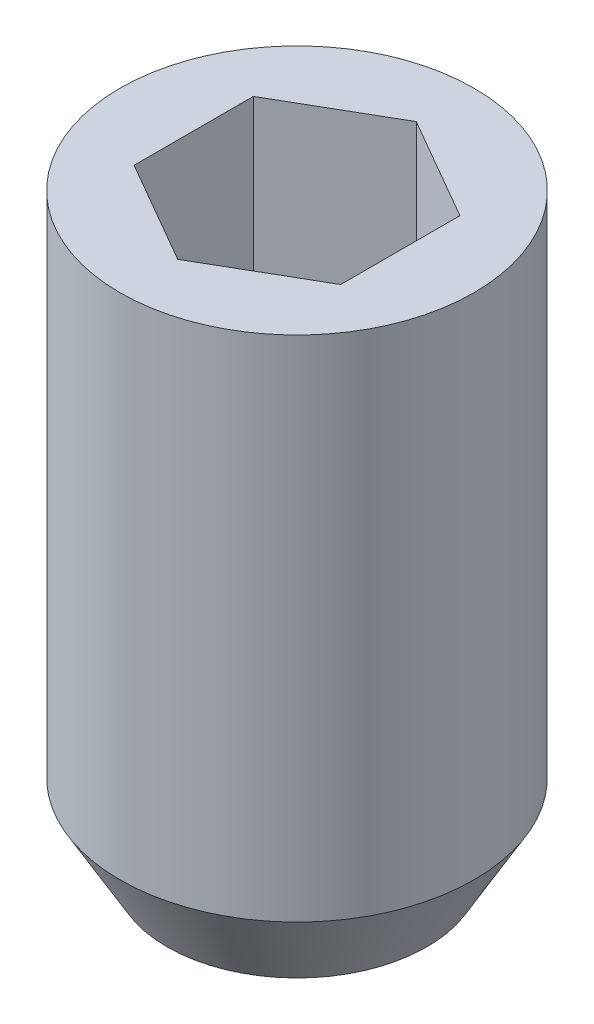
ISO-10303-21;
HEADER;
FILE_DESCRIPTION(('STEP AP214'),'2;1');
FILE_NAME('part.step','',(''),(''),'','','');
FILE_SCHEMA(('AUTOMOTIVE_DESIGN { 1 0 10303 214 1 1 1 1 }'));
ENDSEC;
DATA;
#1=APPLICATION_CONTEXT('core data for automotive mechanical design processes');
#2=APPLICATION_PROTOCOL_DEFINITION('international standard','automotive_design',2000,#1);
#3=PRODUCT_CONTEXT('',#1,'mechanical');
#4=PRODUCT('Part','Part','',(#3));
#5=PRODUCT_RELATED_PRODUCT_CATEGORY('part','',(#4));
#6=PRODUCT_DEFINITION_FORMATION('','',#4);
#7=PRODUCT_DEFINITION_CONTEXT('part definition',#1,'design');
#8=PRODUCT_DEFINITION('design','',#6,#7);
#9=PRODUCT_DEFINITION_SHAPE('','',#8);
#10=(LENGTH_UNIT() NAMED_UNIT(*) SI_UNIT(.MILLI.,.METRE.));
#11=(NAMED_UNIT(*) PLANE_ANGLE_UNIT() SI_UNIT($,.RADIAN.));
#12=(NAMED_UNIT(*) SI_UNIT($,.STERADIAN.) SOLID_ANGLE_UNIT());
#13=UNCERTAINTY_MEASURE_WITH_UNIT(LENGTH_MEASURE(1.E-05),#10,'distance_accuracy_value','');
#14=(GEOMETRIC_REPRESENTATION_CONTEXT(3) GLOBAL_UNCERTAINTY_ASSIGNED_CONTEXT((#13)) GLOBAL_UNIT_ASSIGNED_CONTEXT((#10,
#11,#12)) REPRESENTATION_CONTEXT('',''));
#15=CARTESIAN_POINT('',(0.,0.,0.));
#16=DIRECTION('',(0.,0.,1.));
#17=DIRECTION('',(1.,0.,0.));
#18=AXIS2_PLACEMENT_3D('',#15,#16,#17);
#19=CARTESIAN_POINT('',(0.,5.00000000000007,0.));
#20=DIRECTION('',(0.,-1.,0.));
#21=DIRECTION('',(0.,0.,-1.));
#22=AXIS2_PLACEMENT_3D('',#19,#20,#21);
#23=CYLINDRICAL_SURFACE('',#22,1.5);
#24=CARTESIAN_POINT('',(0.,0.692820323027574,0.));
#25=DIRECTION('',(0.,1.,0.));
#26=DIRECTION('',(0.,0.,1.));
#27=AXIS2_PLACEMENT_3D('',#24,#25,#26);
#28=CIRCLE('',#27,1.5);
#29=CARTESIAN_POINT('',(0.,0.692820323027573,1.50000000000002));
#30=VERTEX_POINT('',#29);
#31=EDGE_CURVE('E56',#30,#30,#28,.T.);
#32=ORIENTED_EDGE('',*,*,#31,.T.);
#33=EDGE_LOOP('',(#32));
#34=FACE_BOUND('',#33,.T.);
#35=CARTESIAN_POINT('',(0.,5.00000000000007,0.));
#36=DIRECTION('',(0.,1.,0.));
#37=DIRECTION('',(0.,0.,1.));
#38=AXIS2_PLACEMENT_3D('',#35,#36,#37);
#39=CIRCLE('',#38,1.5);
#40=CARTESIAN_POINT('',(0.,5.00000000000007,1.50000000000002));
#41=VERTEX_POINT('',#40);
#42=EDGE_CURVE('E150',#41,#41,#39,.T.);
#43=ORIENTED_EDGE('',*,*,#42,.F.);
#44=EDGE_LOOP('',(#43));
#45=FACE_BOUND('',#44,.T.);
#46=ADVANCED_FACE('F48',(#34,#45),#23,.T.);
#47=CARTESIAN_POINT('',(0.,5.00000000000007,0.));
#48=DIRECTION('',(0.,1.,0.));
#49=DIRECTION('',(0.,0.,1.));
#50=AXIS2_PLACEMENT_3D('',#47,#48,#49);
#51=PLANE('',#50);
#52=DIRECTION('',(0.866025403784439,0.,-0.500000000000001));
#53=VECTOR('',#52,1.);
#54=CARTESIAN_POINT('',(-1.04083408558608E-13,5.00000000000003,1.01036297108184));
#55=LINE('',#54,#53);
#56=CARTESIAN_POINT('',(-1.04083408558608E-13,5.00000000000003,1.01036297108184));
#57=VERTEX_POINT('',#56);
#58=CARTESIAN_POINT('',(0.874999999999876,5.00000000000002,0.505181485540962));
#59=VERTEX_POINT('',#58);
#60=EDGE_CURVE('E63',#57,#59,#55,.T.);
#61=ORIENTED_EDGE('',*,*,#60,.F.);
#62=DIRECTION('',(0.866025403784439,0.,0.500000000000001));
#63=VECTOR('',#62,1.);
#64=CARTESIAN_POINT('',(-0.875000000000049,5.00000000000007,0.505181485540962));
#65=LINE('',#64,#63);
#66=CARTESIAN_POINT('',(-0.875000000000049,5.00000000000007,0.505181485540962));
#67=VERTEX_POINT('',#66);
#68=EDGE_CURVE('E146',#67,#57,#65,.T.);
#69=ORIENTED_EDGE('',*,*,#68,.F.);
#70=DIRECTION('',(0.,0.,1.));
#71=VECTOR('',#70,1.);
#72=CARTESIAN_POINT('',(-0.875000000000049,5.00000000000003,-0.505181485540934));
#73=LINE('',#72,#71);
#74=CARTESIAN_POINT('',(-0.875000000000049,5.00000000000003,-0.505181485540934));
#75=VERTEX_POINT('',#74);
#76=EDGE_CURVE('E144',#75,#67,#73,.T.);
#77=ORIENTED_EDGE('',*,*,#76,.F.);
#78=DIRECTION('',(-0.866025403784439,0.,0.500000000000001));
#79=VECTOR('',#78,1.);
#80=CARTESIAN_POINT('',(0.,5.00000000000007,-1.01036297108183));
#81=LINE('',#80,#79);
#82=CARTESIAN_POINT('',(0.,5.00000000000007,-1.01036297108183));
#83=VERTEX_POINT('',#82);
#84=EDGE_CURVE('E111',#83,#75,#81,.T.);
#85=ORIENTED_EDGE('',*,*,#84,.F.);
#86=DIRECTION('',(-0.866025403784438,0.,-0.5));
#87=VECTOR('',#86,1.);
#88=CARTESIAN_POINT('',(0.874999999999911,5.0000000000001,-0.505181485540893));
#89=LINE('',#88,#87);
#90=CARTESIAN_POINT('',(0.874999999999911,5.0000000000001,-0.505181485540893));
#91=VERTEX_POINT('',#90);
#92=EDGE_CURVE('E140',#91,#83,#89,.T.);
#93=ORIENTED_EDGE('',*,*,#92,.F.);
#94=DIRECTION('',(0.,0.,-1.));
#95=VECTOR('',#94,1.);
#96=CARTESIAN_POINT('',(0.874999999999876,5.00000000000002,0.505181485540962));
#97=LINE('',#96,#95);
#98=EDGE_CURVE('E137',#59,#91,#97,.T.);
#99=ORIENTED_EDGE('',*,*,#98,.F.);
#100=EDGE_LOOP('',(#61,#69,#77,#85,#93,#99));
#101=FACE_BOUND('',#100,.T.);
#102=ORIENTED_EDGE('',*,*,#42,.T.);
#103=EDGE_LOOP('',(#102));
#104=FACE_BOUND('',#103,.T.);
#105=ADVANCED_FACE('F172',(#101,#104),#51,.T.);
#106=CARTESIAN_POINT('',(0.,0.,0.));
#107=DIRECTION('',(0.,1.,0.));
#108=DIRECTION('',(0.,0.,1.));
#109=AXIS2_PLACEMENT_3D('',#106,#107,#108);
#110=PLANE('',#109);
#111=CARTESIAN_POINT('',(0.,0.,0.));
#112=DIRECTION('',(0.,1.,0.));
#113=DIRECTION('',(0.,0.,1.));
#114=AXIS2_PLACEMENT_3D('',#111,#112,#113);
#115=CIRCLE('',#114,1.1);
#116=CARTESIAN_POINT('',(0.,0.,1.1));
#117=VERTEX_POINT('',#116);
#118=EDGE_CURVE('E13',#117,#117,#115,.F.);
#119=ORIENTED_EDGE('',*,*,#118,.T.);
#120=EDGE_LOOP('',(#119));
#121=FACE_BOUND('',#120,.T.);
#122=ADVANCED_FACE('F164',(#121),#110,.F.);
#123=CARTESIAN_POINT('',(0.,0.692820323027574,0.));
#124=DIRECTION('',(0.,1.,0.));
#125=DIRECTION('',(0.,0.,1.));
#126=AXIS2_PLACEMENT_3D('',#123,#124,#125);
#127=CONICAL_SURFACE('',#126,1.5,0.5235987755983);
#128=ORIENTED_EDGE('',*,*,#118,.F.);
#129=EDGE_LOOP('',(#128));
#130=FACE_BOUND('',#129,.T.);
#131=ORIENTED_EDGE('',*,*,#31,.F.);
#132=EDGE_LOOP('',(#131));
#133=FACE_BOUND('',#132,.T.);
#134=ADVANCED_FACE('F50',(#130,#133),#127,.T.);
#135=CARTESIAN_POINT('',(-1.17961196366423E-13,2.00000000000003,1.01036297108185));
#136=DIRECTION('',(0.499999999999999,0.,0.866025403784439));
#137=DIRECTION('',(0.866025403784439,0.,-0.500000000000001));
#138=AXIS2_PLACEMENT_3D('',#135,#136,#137);
#139=PLANE('',#138);
#140=ORIENTED_EDGE('',*,*,#60,.T.);
#141=DIRECTION('',(0.,1.,0.));
#142=VECTOR('',#141,1.);
#143=CARTESIAN_POINT('',(0.874999999999952,2.00000000000007,0.50518148554092));
#144=LINE('',#143,#142);
#145=CARTESIAN_POINT('',(0.874999999999952,2.00000000000007,0.50518148554092));
#146=VERTEX_POINT('',#145);
#147=EDGE_CURVE('E93',#146,#59,#144,.T.);
#148=ORIENTED_EDGE('',*,*,#147,.F.);
#149=DIRECTION('',(0.866025403784439,0.,-0.500000000000001));
#150=VECTOR('',#149,1.);
#151=CARTESIAN_POINT('',(-1.17961196366423E-13,2.00000000000003,1.01036297108185));
#152=LINE('',#151,#150);
#153=CARTESIAN_POINT('',(-1.17961196366423E-13,2.00000000000003,1.01036297108185));
#154=VERTEX_POINT('',#153);
#155=EDGE_CURVE('E148',#154,#146,#152,.T.);
#156=ORIENTED_EDGE('',*,*,#155,.F.);
#157=DIRECTION('',(0.,1.,0.));
#158=VECTOR('',#157,1.);
#159=CARTESIAN_POINT('',(-1.17961196366423E-13,2.00000000000003,1.01036297108185));
#160=LINE('',#159,#158);
#161=EDGE_CURVE('E71',#154,#57,#160,.T.);
#162=ORIENTED_EDGE('',*,*,#161,.T.);
#163=EDGE_LOOP('',(#140,#148,#156,#162));
#164=FACE_BOUND('',#163,.T.);
#165=ADVANCED_FACE('F163',(#164),#139,.F.);
#166=CARTESIAN_POINT('',(-0.875000000000119,2.00000000000003,0.505181485540948));
#167=DIRECTION('',(-0.5,0.,0.86602540378444));
#168=DIRECTION('',(0.866025403784439,0.,0.500000000000001));
#169=AXIS2_PLACEMENT_3D('',#166,#167,#168);
#170=PLANE('',#169);
#171=ORIENTED_EDGE('',*,*,#68,.T.);
#172=ORIENTED_EDGE('',*,*,#161,.F.);
#173=DIRECTION('',(0.866025403784439,0.,0.500000000000001));
#174=VECTOR('',#173,1.);
#175=CARTESIAN_POINT('',(-0.875000000000119,2.00000000000003,0.505181485540948));
#176=LINE('',#175,#174);
#177=CARTESIAN_POINT('',(-0.875000000000119,2.00000000000003,0.505181485540948));
#178=VERTEX_POINT('',#177);
#179=EDGE_CURVE('E123',#178,#154,#176,.T.);
#180=ORIENTED_EDGE('',*,*,#179,.F.);
#181=DIRECTION('',(0.,1.,0.));
#182=VECTOR('',#181,1.);
#183=CARTESIAN_POINT('',(-0.875000000000119,2.00000000000003,0.505181485540948));
#184=LINE('',#183,#182);
#185=EDGE_CURVE('E115',#178,#67,#184,.T.);
#186=ORIENTED_EDGE('',*,*,#185,.T.);
#187=EDGE_LOOP('',(#171,#172,#180,#186));
#188=FACE_BOUND('',#187,.T.);
#189=ADVANCED_FACE('F170',(#188),#170,.F.);
#190=CARTESIAN_POINT('',(-0.875000000000077,2.00000000000003,-0.505181485540934));
#191=DIRECTION('',(-0.999999999999999,0.,0.));
#192=DIRECTION('',(0.,0.,1.));
#193=AXIS2_PLACEMENT_3D('',#190,#191,#192);
#194=PLANE('',#193);
#195=ORIENTED_EDGE('',*,*,#76,.T.);
#196=ORIENTED_EDGE('',*,*,#185,.F.);
#197=DIRECTION('',(0.,0.,1.));
#198=VECTOR('',#197,1.);
#199=CARTESIAN_POINT('',(-0.875000000000077,2.00000000000003,-0.505181485540934));
#200=LINE('',#199,#198);
#201=CARTESIAN_POINT('',(-0.875000000000077,2.00000000000003,-0.505181485540934));
#202=VERTEX_POINT('',#201);
#203=EDGE_CURVE('E119',#202,#178,#200,.T.);
#204=ORIENTED_EDGE('',*,*,#203,.F.);
#205=DIRECTION('',(0.,1.,0.));
#206=VECTOR('',#205,1.);
#207=CARTESIAN_POINT('',(-0.875000000000077,2.00000000000003,-0.505181485540934));
#208=LINE('',#207,#206);
#209=EDGE_CURVE('E104',#202,#75,#208,.T.);
#210=ORIENTED_EDGE('',*,*,#209,.T.);
#211=EDGE_LOOP('',(#195,#196,#204,#210));
#212=FACE_BOUND('',#211,.T.);
#213=ADVANCED_FACE('F120',(#212),#194,.F.);
#214=CARTESIAN_POINT('',(0.,2.00000000000004,-1.01036297108184));
#215=DIRECTION('',(-0.499999999999999,0.,-0.866025403784439));
#216=DIRECTION('',(-0.866025403784439,0.,0.5));
#217=AXIS2_PLACEMENT_3D('',#214,#215,#216);
#218=PLANE('',#217);
#219=ORIENTED_EDGE('',*,*,#84,.T.);
#220=ORIENTED_EDGE('',*,*,#209,.F.);
#221=DIRECTION('',(-0.866025403784439,0.,0.500000000000001));
#222=VECTOR('',#221,1.);
#223=CARTESIAN_POINT('',(0.,2.00000000000004,-1.01036297108184));
#224=LINE('',#223,#222);
#225=CARTESIAN_POINT('',(0.,2.00000000000004,-1.01036297108184));
#226=VERTEX_POINT('',#225);
#227=EDGE_CURVE('E108',#226,#202,#224,.T.);
#228=ORIENTED_EDGE('',*,*,#227,.F.);
#229=DIRECTION('',(0.,1.,0.));
#230=VECTOR('',#229,1.);
#231=CARTESIAN_POINT('',(0.,2.00000000000004,-1.01036297108184));
#232=LINE('',#231,#230);
#233=EDGE_CURVE('E116',#226,#83,#232,.T.);
#234=ORIENTED_EDGE('',*,*,#233,.T.);
#235=EDGE_LOOP('',(#219,#220,#228,#234));
#236=FACE_BOUND('',#235,.T.);
#237=ADVANCED_FACE('F106',(#236),#218,.F.);
#238=CARTESIAN_POINT('',(0.874999999999911,2.00000000000004,-0.50518148554092));
#239=DIRECTION('',(0.5,0.,-0.866025403784439));
#240=DIRECTION('',(-0.866025403784438,0.,-0.5));
#241=AXIS2_PLACEMENT_3D('',#238,#239,#240);
#242=PLANE('',#241);
#243=ORIENTED_EDGE('',*,*,#92,.T.);
#244=ORIENTED_EDGE('',*,*,#233,.F.);
#245=DIRECTION('',(-0.866025403784438,0.,-0.5));
#246=VECTOR('',#245,1.);
#247=CARTESIAN_POINT('',(0.874999999999911,2.00000000000004,-0.50518148554092));
#248=LINE('',#247,#246);
#249=CARTESIAN_POINT('',(0.874999999999911,2.00000000000004,-0.50518148554092));
#250=VERTEX_POINT('',#249);
#251=EDGE_CURVE('E129',#250,#226,#248,.T.);
#252=ORIENTED_EDGE('',*,*,#251,.F.);
#253=DIRECTION('',(0.,1.,0.));
#254=VECTOR('',#253,1.);
#255=CARTESIAN_POINT('',(0.874999999999911,2.00000000000004,-0.50518148554092));
#256=LINE('',#255,#254);
#257=EDGE_CURVE('E153',#250,#91,#256,.T.);
#258=ORIENTED_EDGE('',*,*,#257,.T.);
#259=EDGE_LOOP('',(#243,#244,#252,#258));
#260=FACE_BOUND('',#259,.T.);
#261=ADVANCED_FACE('F186',(#260),#242,.F.);
#262=CARTESIAN_POINT('',(0.874999999999952,2.00000000000007,0.50518148554092));
#263=DIRECTION('',(0.999999999999999,0.,0.));
#264=DIRECTION('',(0.,0.,-1.));
#265=AXIS2_PLACEMENT_3D('',#262,#263,#264);
#266=PLANE('',#265);
#267=ORIENTED_EDGE('',*,*,#98,.T.);
#268=ORIENTED_EDGE('',*,*,#257,.F.);
#269=DIRECTION('',(0.,0.,-1.));
#270=VECTOR('',#269,1.);
#271=CARTESIAN_POINT('',(0.874999999999952,2.00000000000007,0.50518148554092));
#272=LINE('',#271,#270);
#273=EDGE_CURVE('E131',#146,#250,#272,.T.);
#274=ORIENTED_EDGE('',*,*,#273,.F.);
#275=ORIENTED_EDGE('',*,*,#147,.T.);
#276=EDGE_LOOP('',(#267,#268,#274,#275));
#277=FACE_BOUND('',#276,.T.);
#278=ADVANCED_FACE('F183',(#277),#266,.F.);
#279=CARTESIAN_POINT('',(0.,2.,0.));
#280=DIRECTION('',(0.,1.,0.));
#281=DIRECTION('',(0.,0.,1.));
#282=AXIS2_PLACEMENT_3D('',#279,#280,#281);
#283=PLANE('',#282);
#284=ORIENTED_EDGE('',*,*,#155,.T.);
#285=ORIENTED_EDGE('',*,*,#273,.T.);
#286=ORIENTED_EDGE('',*,*,#251,.T.);
#287=ORIENTED_EDGE('',*,*,#227,.T.);
#288=ORIENTED_EDGE('',*,*,#203,.T.);
#289=ORIENTED_EDGE('',*,*,#179,.T.);
#290=EDGE_LOOP('',(#284,#285,#286,#287,#288,#289));
#291=FACE_BOUND('',#290,.T.);
#292=ADVANCED_FACE('F126',(#291),#283,.T.);
#293=CLOSED_SHELL('',(#46,#105,#122,#134,#165,#189,#213,#237,#261,#278,#292));
#294=MANIFOLD_SOLID_BREP('B2',#293);
#295=ADVANCED_BREP_SHAPE_REPRESENTATION('',(#18,#294),#14);
#296=SHAPE_DEFINITION_REPRESENTATION(#9,#295);
ENDSEC;
END-ISO-10303-21;
